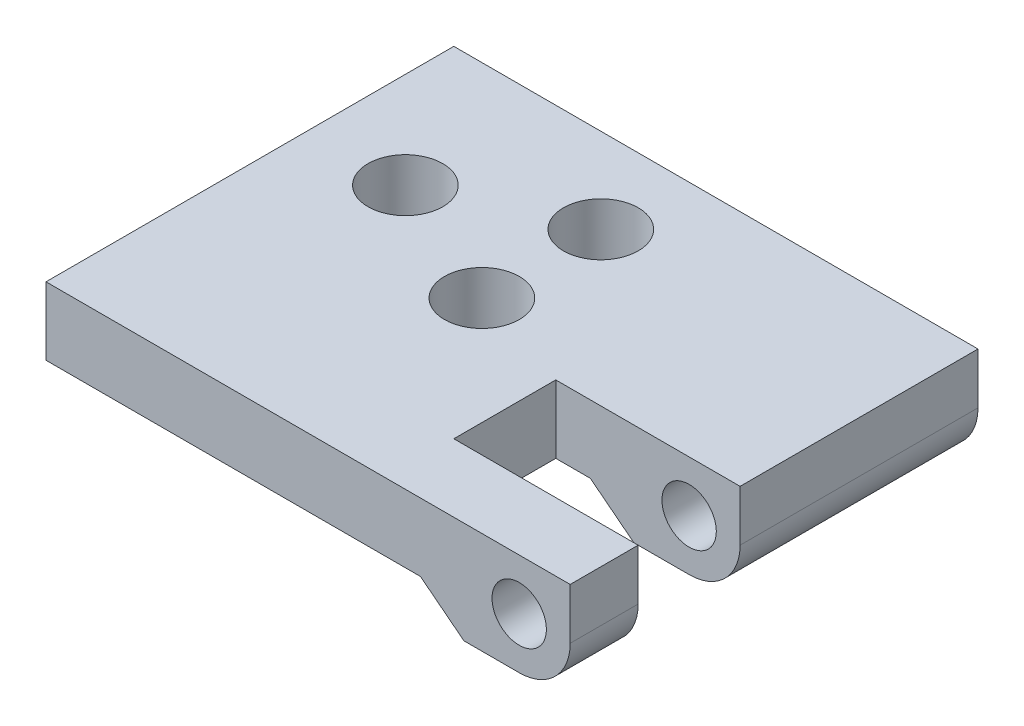
ISO-10303-21;
HEADER;
FILE_DESCRIPTION(('STEP AP214'),'2;1');
FILE_NAME('part.step','',(''),(''),'','','');
FILE_SCHEMA(('AUTOMOTIVE_DESIGN { 1 0 10303 214 1 1 1 1 }'));
ENDSEC;
DATA;
#1=APPLICATION_CONTEXT('core data for automotive mechanical design processes');
#2=APPLICATION_PROTOCOL_DEFINITION('international standard','automotive_design',2000,#1);
#3=PRODUCT_CONTEXT('',#1,'mechanical');
#4=PRODUCT('Part','Part','',(#3));
#5=PRODUCT_RELATED_PRODUCT_CATEGORY('part','',(#4));
#6=PRODUCT_DEFINITION_FORMATION('','',#4);
#7=PRODUCT_DEFINITION_CONTEXT('part definition',#1,'design');
#8=PRODUCT_DEFINITION('design','',#6,#7);
#9=PRODUCT_DEFINITION_SHAPE('','',#8);
#10=(LENGTH_UNIT() NAMED_UNIT(*) SI_UNIT(.MILLI.,.METRE.));
#11=(NAMED_UNIT(*) PLANE_ANGLE_UNIT() SI_UNIT($,.RADIAN.));
#12=(NAMED_UNIT(*) SI_UNIT($,.STERADIAN.) SOLID_ANGLE_UNIT());
#13=UNCERTAINTY_MEASURE_WITH_UNIT(LENGTH_MEASURE(1.E-05),#10,'distance_accuracy_value','');
#14=(GEOMETRIC_REPRESENTATION_CONTEXT(3) GLOBAL_UNCERTAINTY_ASSIGNED_CONTEXT((#13)) GLOBAL_UNIT_ASSIGNED_CONTEXT((#10,
#11,#12)) REPRESENTATION_CONTEXT('',''));
#15=CARTESIAN_POINT('',(0.,0.,0.));
#16=DIRECTION('',(0.,0.,1.));
#17=DIRECTION('',(1.,0.,0.));
#18=AXIS2_PLACEMENT_3D('',#15,#16,#17);
#19=CARTESIAN_POINT('',(2.15277777777778,3.,14.2992424242425));
#20=DIRECTION('',(0.,0.,-1.));
#21=DIRECTION('',(-1.,0.,0.));
#22=AXIS2_PLACEMENT_3D('',#19,#20,#21);
#23=CYLINDRICAL_SURFACE('',#22,3.);
#24=CARTESIAN_POINT('',(2.15277777777778,3.,10.2992424242425));
#25=DIRECTION('',(0.,0.,1.));
#26=DIRECTION('',(1.,0.,0.));
#27=AXIS2_PLACEMENT_3D('',#24,#25,#26);
#28=CIRCLE('',#27,3.);
#29=CARTESIAN_POINT('',(5.15277777777778,3.,10.2992424242425));
#30=VERTEX_POINT('',#29);
#31=CARTESIAN_POINT('',(2.15277777777778,0.,10.2992424242425));
#32=VERTEX_POINT('',#31);
#33=EDGE_CURVE('E194',#30,#32,#28,.F.);
#34=ORIENTED_EDGE('',*,*,#33,.F.);
#35=DIRECTION('',(0.,0.,-1.));
#36=VECTOR('',#35,1.);
#37=CARTESIAN_POINT('',(5.15277777777778,3.,14.2992424242425));
#38=LINE('',#37,#36);
#39=CARTESIAN_POINT('',(5.15277777777778,3.,14.2992424242425));
#40=VERTEX_POINT('',#39);
#41=EDGE_CURVE('E179',#40,#30,#38,.T.);
#42=ORIENTED_EDGE('',*,*,#41,.F.);
#43=CARTESIAN_POINT('',(2.15277777777778,3.,14.2992424242425));
#44=DIRECTION('',(0.,0.,1.));
#45=DIRECTION('',(1.,0.,0.));
#46=AXIS2_PLACEMENT_3D('',#43,#44,#45);
#47=CIRCLE('',#46,3.);
#48=CARTESIAN_POINT('',(2.15277777777778,0.,14.2992424242425));
#49=VERTEX_POINT('',#48);
#50=EDGE_CURVE('E181',#49,#40,#47,.T.);
#51=ORIENTED_EDGE('',*,*,#50,.F.);
#52=DIRECTION('',(0.,0.,-1.));
#53=VECTOR('',#52,1.);
#54=CARTESIAN_POINT('',(2.15277777777778,0.,14.2992424242425));
#55=LINE('',#54,#53);
#56=EDGE_CURVE('E189',#49,#32,#55,.T.);
#57=ORIENTED_EDGE('',*,*,#56,.T.);
#58=EDGE_LOOP('',(#34,#42,#51,#57));
#59=FACE_BOUND('',#58,.T.);
#60=ADVANCED_FACE('F41',(#59),#23,.T.);
#61=CARTESIAN_POINT('',(5.15277777777778,0.,14.2992424242425));
#62=DIRECTION('',(1.,0.,0.));
#63=DIRECTION('',(0.,1.,0.));
#64=AXIS2_PLACEMENT_3D('',#61,#62,#63);
#65=PLANE('',#64);
#66=DIRECTION('',(0.,-1.,0.));
#67=VECTOR('',#66,1.);
#68=CARTESIAN_POINT('',(5.15277777777778,0.,10.2992424242425));
#69=LINE('',#68,#67);
#70=CARTESIAN_POINT('',(5.15277777777778,6.,10.2992424242425));
#71=VERTEX_POINT('',#70);
#72=EDGE_CURVE('E11',#71,#30,#69,.T.);
#73=ORIENTED_EDGE('',*,*,#72,.F.);
#74=DIRECTION('',(0.,0.,-1.));
#75=VECTOR('',#74,1.);
#76=CARTESIAN_POINT('',(5.15277777777778,6.,14.2992424242425));
#77=LINE('',#76,#75);
#78=CARTESIAN_POINT('',(5.15277777777778,6.,14.2992424242425));
#79=VERTEX_POINT('',#78);
#80=EDGE_CURVE('E169',#79,#71,#77,.T.);
#81=ORIENTED_EDGE('',*,*,#80,.F.);
#82=DIRECTION('',(0.,-1.,0.));
#83=VECTOR('',#82,1.);
#84=CARTESIAN_POINT('',(5.15277777777778,0.,14.2992424242425));
#85=LINE('',#84,#83);
#86=EDGE_CURVE('E170',#79,#40,#85,.T.);
#87=ORIENTED_EDGE('',*,*,#86,.T.);
#88=ORIENTED_EDGE('',*,*,#41,.T.);
#89=EDGE_LOOP('',(#73,#81,#87,#88));
#90=FACE_BOUND('',#89,.T.);
#91=ADVANCED_FACE('F348',(#90),#65,.T.);
#92=CARTESIAN_POINT('',(0.,0.,0.));
#93=DIRECTION('',(0.,1.,0.));
#94=DIRECTION('',(0.,0.,1.));
#95=AXIS2_PLACEMENT_3D('',#92,#93,#94);
#96=PLANE('',#95);
#97=DIRECTION('',(-1.,0.,0.));
#98=VECTOR('',#97,1.);
#99=CARTESIAN_POINT('',(0.,0.,10.2992424242425));
#100=LINE('',#99,#98);
#101=CARTESIAN_POINT('',(-1.10011235807583,0.,10.2992424242425));
#102=VERTEX_POINT('',#101);
#103=EDGE_CURVE('E269',#32,#102,#100,.T.);
#104=ORIENTED_EDGE('',*,*,#103,.F.);
#105=ORIENTED_EDGE('',*,*,#56,.F.);
#106=DIRECTION('',(1.,0.,0.));
#107=VECTOR('',#106,1.);
#108=CARTESIAN_POINT('',(0.,0.,14.2992424242425));
#109=LINE('',#108,#107);
#110=CARTESIAN_POINT('',(-1.10011235807583,0.,14.2992424242425));
#111=VERTEX_POINT('',#110);
#112=EDGE_CURVE('E275',#111,#49,#109,.T.);
#113=ORIENTED_EDGE('',*,*,#112,.F.);
#114=DIRECTION('',(0.,0.,1.));
#115=VECTOR('',#114,1.);
#116=CARTESIAN_POINT('',(-1.10011235807583,0.,-12.7007575757576));
#117=LINE('',#116,#115);
#118=EDGE_CURVE('E202',#102,#111,#117,.T.);
#119=ORIENTED_EDGE('',*,*,#118,.F.);
#120=EDGE_LOOP('',(#104,#105,#113,#119));
#121=FACE_BOUND('',#120,.T.);
#122=ADVANCED_FACE('F383',(#121),#96,.F.);
#123=CARTESIAN_POINT('',(0.,6.,10.2992424242425));
#124=DIRECTION('',(0.,0.,1.));
#125=DIRECTION('',(1.,0.,0.));
#126=AXIS2_PLACEMENT_3D('',#123,#124,#125);
#127=PLANE('',#126);
#128=CARTESIAN_POINT('',(2.15277777777778,3.,10.2992424242425));
#129=DIRECTION('',(0.,0.,1.));
#130=DIRECTION('',(1.,0.,0.));
#131=AXIS2_PLACEMENT_3D('',#128,#129,#130);
#132=CIRCLE('',#131,1.6);
#133=CARTESIAN_POINT('',(3.75277777777778,3.,10.2992424242425));
#134=VERTEX_POINT('',#133);
#135=EDGE_CURVE('E265',#134,#134,#132,.T.);
#136=ORIENTED_EDGE('',*,*,#135,.T.);
#137=EDGE_LOOP('',(#136));
#138=FACE_BOUND('',#137,.T.);
#139=DIRECTION('',(-1.,0.,0.));
#140=VECTOR('',#139,1.);
#141=CARTESIAN_POINT('',(0.,6.,10.2992424242425));
#142=LINE('',#141,#140);
#143=CARTESIAN_POINT('',(-5.69444444444444,6.,10.2992424242425));
#144=VERTEX_POINT('',#143);
#145=EDGE_CURVE('E64',#71,#144,#142,.T.);
#146=ORIENTED_EDGE('',*,*,#145,.F.);
#147=ORIENTED_EDGE('',*,*,#72,.T.);
#148=ORIENTED_EDGE('',*,*,#33,.T.);
#149=ORIENTED_EDGE('',*,*,#103,.T.);
#150=DIRECTION('',(0.787792651553475,-0.615940531348884,0.));
#151=VECTOR('',#150,1.);
#152=CARTESIAN_POINT('',(-3.3287641850322,1.74248514222652,10.2992424242425));
#153=LINE('',#152,#151);
#154=CARTESIAN_POINT('',(-3.65812765811865,2.,10.2992424242425));
#155=VERTEX_POINT('',#154);
#156=EDGE_CURVE('E214',#155,#102,#153,.T.);
#157=ORIENTED_EDGE('',*,*,#156,.F.);
#158=DIRECTION('',(1.,0.,0.));
#159=VECTOR('',#158,1.);
#160=CARTESIAN_POINT('',(0.,2.,10.2992424242425));
#161=LINE('',#160,#159);
#162=CARTESIAN_POINT('',(-5.69444444444444,2.,10.2992424242425));
#163=VERTEX_POINT('',#162);
#164=EDGE_CURVE('E249',#163,#155,#161,.T.);
#165=ORIENTED_EDGE('',*,*,#164,.F.);
#166=DIRECTION('',(0.,-1.,0.));
#167=VECTOR('',#166,1.);
#168=CARTESIAN_POINT('',(-5.69444444444444,6.,10.2992424242425));
#169=LINE('',#168,#167);
#170=EDGE_CURVE('E163',#144,#163,#169,.T.);
#171=ORIENTED_EDGE('',*,*,#170,.F.);
#172=EDGE_LOOP('',(#146,#147,#148,#149,#157,#165,#171));
#173=FACE_BOUND('',#172,.T.);
#174=ADVANCED_FACE('F341',(#138,#173),#127,.F.);
#175=CARTESIAN_POINT('',(0.,6.,4.29924242424245));
#176=DIRECTION('',(0.,0.,1.));
#177=DIRECTION('',(1.,0.,0.));
#178=AXIS2_PLACEMENT_3D('',#175,#176,#177);
#179=PLANE('',#178);
#180=CARTESIAN_POINT('',(2.15277777777778,3.,4.29924242424245));
#181=DIRECTION('',(0.,0.,1.));
#182=DIRECTION('',(1.,0.,0.));
#183=AXIS2_PLACEMENT_3D('',#180,#181,#182);
#184=CIRCLE('',#183,3.);
#185=CARTESIAN_POINT('',(5.15277777777778,3.,4.29924242424245));
#186=VERTEX_POINT('',#185);
#187=CARTESIAN_POINT('',(2.15277777777778,0.,4.29924242424245));
#188=VERTEX_POINT('',#187);
#189=EDGE_CURVE('E57',#186,#188,#184,.F.);
#190=ORIENTED_EDGE('',*,*,#189,.F.);
#191=DIRECTION('',(0.,1.,0.));
#192=VECTOR('',#191,1.);
#193=CARTESIAN_POINT('',(5.15277777777778,0.,4.29924242424245));
#194=LINE('',#193,#192);
#195=CARTESIAN_POINT('',(5.15277777777779,6.,4.29924242424245));
#196=VERTEX_POINT('',#195);
#197=EDGE_CURVE('E50',#186,#196,#194,.T.);
#198=ORIENTED_EDGE('',*,*,#197,.T.);
#199=DIRECTION('',(-1.,0.,0.));
#200=VECTOR('',#199,1.);
#201=CARTESIAN_POINT('',(0.,6.,4.29924242424245));
#202=LINE('',#201,#200);
#203=CARTESIAN_POINT('',(-5.69444444444444,6.,4.29924242424245));
#204=VERTEX_POINT('',#203);
#205=EDGE_CURVE('E144',#196,#204,#202,.T.);
#206=ORIENTED_EDGE('',*,*,#205,.T.);
#207=DIRECTION('',(0.,-1.,0.));
#208=VECTOR('',#207,1.);
#209=CARTESIAN_POINT('',(-5.69444444444444,6.,4.29924242424245));
#210=LINE('',#209,#208);
#211=CARTESIAN_POINT('',(-5.69444444444444,2.,4.29924242424245));
#212=VERTEX_POINT('',#211);
#213=EDGE_CURVE('E315',#204,#212,#210,.T.);
#214=ORIENTED_EDGE('',*,*,#213,.T.);
#215=DIRECTION('',(1.,0.,0.));
#216=VECTOR('',#215,1.);
#217=CARTESIAN_POINT('',(0.,2.,4.29924242424245));
#218=LINE('',#217,#216);
#219=CARTESIAN_POINT('',(-3.65812765811865,2.,4.29924242424245));
#220=VERTEX_POINT('',#219);
#221=EDGE_CURVE('E242',#212,#220,#218,.T.);
#222=ORIENTED_EDGE('',*,*,#221,.T.);
#223=DIRECTION('',(0.787792651553475,-0.615940531348884,0.));
#224=VECTOR('',#223,1.);
#225=CARTESIAN_POINT('',(-3.3287641850322,1.74248514222653,4.29924242424245));
#226=LINE('',#225,#224);
#227=CARTESIAN_POINT('',(-1.10011235807583,0.,4.29924242424245));
#228=VERTEX_POINT('',#227);
#229=EDGE_CURVE('E210',#220,#228,#226,.T.);
#230=ORIENTED_EDGE('',*,*,#229,.T.);
#231=DIRECTION('',(-1.,0.,0.));
#232=VECTOR('',#231,1.);
#233=CARTESIAN_POINT('',(0.,0.,4.29924242424245));
#234=LINE('',#233,#232);
#235=EDGE_CURVE('E298',#188,#228,#234,.T.);
#236=ORIENTED_EDGE('',*,*,#235,.F.);
#237=EDGE_LOOP('',(#190,#198,#206,#214,#222,#230,#236));
#238=FACE_BOUND('',#237,.T.);
#239=CARTESIAN_POINT('',(2.15277777777778,3.,4.29924242424245));
#240=DIRECTION('',(0.,0.,1.));
#241=DIRECTION('',(1.,0.,0.));
#242=AXIS2_PLACEMENT_3D('',#239,#240,#241);
#243=CIRCLE('',#242,1.6);
#244=CARTESIAN_POINT('',(3.75277777777778,3.,4.29924242424245));
#245=VERTEX_POINT('',#244);
#246=EDGE_CURVE('E261',#245,#245,#243,.T.);
#247=ORIENTED_EDGE('',*,*,#246,.F.);
#248=EDGE_LOOP('',(#247));
#249=FACE_BOUND('',#248,.T.);
#250=ADVANCED_FACE('F158',(#238,#249),#179,.T.);
#251=CARTESIAN_POINT('',(0.,6.,-9.70075757575754));
#252=DIRECTION('',(0.,0.,-1.));
#253=DIRECTION('',(-1.,0.,0.));
#254=AXIS2_PLACEMENT_3D('',#251,#252,#253);
#255=PLANE('',#254);
#256=CARTESIAN_POINT('',(2.15277777777778,3.,-9.70075757575754));
#257=DIRECTION('',(0.,0.,1.));
#258=DIRECTION('',(1.,0.,0.));
#259=AXIS2_PLACEMENT_3D('',#256,#257,#258);
#260=CIRCLE('',#259,3.);
#261=CARTESIAN_POINT('',(2.15277777777778,0.,-9.70075757575754));
#262=VERTEX_POINT('',#261);
#263=CARTESIAN_POINT('',(5.15277777777778,3.,-9.70075757575754));
#264=VERTEX_POINT('',#263);
#265=EDGE_CURVE('E185',#262,#264,#260,.T.);
#266=ORIENTED_EDGE('',*,*,#265,.F.);
#267=DIRECTION('',(1.,0.,0.));
#268=VECTOR('',#267,1.);
#269=CARTESIAN_POINT('',(0.,0.,-9.70075757575754));
#270=LINE('',#269,#268);
#271=CARTESIAN_POINT('',(-1.10011235807583,0.,-9.70075757575754));
#272=VERTEX_POINT('',#271);
#273=EDGE_CURVE('E301',#272,#262,#270,.T.);
#274=ORIENTED_EDGE('',*,*,#273,.F.);
#275=DIRECTION('',(-0.787792651553475,0.615940531348884,0.));
#276=VECTOR('',#275,1.);
#277=CARTESIAN_POINT('',(-3.32876418503221,1.74248514222653,-9.70075757575754));
#278=LINE('',#277,#276);
#279=CARTESIAN_POINT('',(-3.65812765811865,2.,-9.70075757575754));
#280=VERTEX_POINT('',#279);
#281=EDGE_CURVE('E206',#272,#280,#278,.T.);
#282=ORIENTED_EDGE('',*,*,#281,.T.);
#283=DIRECTION('',(1.,0.,0.));
#284=VECTOR('',#283,1.);
#285=CARTESIAN_POINT('',(-25.6944444444444,2.,-9.70075757575754));
#286=LINE('',#285,#284);
#287=CARTESIAN_POINT('',(-25.6944444444444,2.,-9.70075757575754));
#288=VERTEX_POINT('',#287);
#289=EDGE_CURVE('E221',#288,#280,#286,.T.);
#290=ORIENTED_EDGE('',*,*,#289,.F.);
#291=DIRECTION('',(0.,-1.,0.));
#292=VECTOR('',#291,1.);
#293=CARTESIAN_POINT('',(-25.6944444444444,6.,-9.70075757575754));
#294=LINE('',#293,#292);
#295=CARTESIAN_POINT('',(-25.6944444444444,6.,-9.70075757575754));
#296=VERTEX_POINT('',#295);
#297=EDGE_CURVE('E311',#296,#288,#294,.T.);
#298=ORIENTED_EDGE('',*,*,#297,.F.);
#299=DIRECTION('',(1.,0.,0.));
#300=VECTOR('',#299,1.);
#301=CARTESIAN_POINT('',(0.,6.,-9.70075757575754));
#302=LINE('',#301,#300);
#303=CARTESIAN_POINT('',(5.15277777777778,6.,-9.70075757575754));
#304=VERTEX_POINT('',#303);
#305=EDGE_CURVE('E156',#296,#304,#302,.T.);
#306=ORIENTED_EDGE('',*,*,#305,.T.);
#307=DIRECTION('',(0.,-1.,0.));
#308=VECTOR('',#307,1.);
#309=CARTESIAN_POINT('',(5.15277777777778,0.,-9.70075757575754));
#310=LINE('',#309,#308);
#311=EDGE_CURVE('E167',#304,#264,#310,.T.);
#312=ORIENTED_EDGE('',*,*,#311,.T.);
#313=EDGE_LOOP('',(#266,#274,#282,#290,#298,#306,#312));
#314=FACE_BOUND('',#313,.T.);
#315=CARTESIAN_POINT('',(2.15277777777778,3.,-9.70075757575754));
#316=DIRECTION('',(0.,0.,-1.));
#317=DIRECTION('',(-1.,0.,0.));
#318=AXIS2_PLACEMENT_3D('',#315,#316,#317);
#319=CIRCLE('',#318,1.6);
#320=CARTESIAN_POINT('',(0.552777777777779,3.,-9.70075757575754));
#321=VERTEX_POINT('',#320);
#322=EDGE_CURVE('E257',#321,#321,#319,.T.);
#323=ORIENTED_EDGE('',*,*,#322,.F.);
#324=EDGE_LOOP('',(#323));
#325=FACE_BOUND('',#324,.T.);
#326=ADVANCED_FACE('F364',(#314,#325),#255,.T.);
#327=CARTESIAN_POINT('',(0.,6.,14.2992424242425));
#328=DIRECTION('',(0.,0.,-1.));
#329=DIRECTION('',(-1.,0.,0.));
#330=AXIS2_PLACEMENT_3D('',#327,#328,#329);
#331=PLANE('',#330);
#332=CARTESIAN_POINT('',(2.15277777777778,3.,14.2992424242425));
#333=DIRECTION('',(0.,0.,1.));
#334=DIRECTION('',(1.,0.,0.));
#335=AXIS2_PLACEMENT_3D('',#332,#333,#334);
#336=CIRCLE('',#335,1.6);
#337=CARTESIAN_POINT('',(3.75277777777778,3.,14.2992424242425));
#338=VERTEX_POINT('',#337);
#339=EDGE_CURVE('E253',#338,#338,#336,.T.);
#340=ORIENTED_EDGE('',*,*,#339,.F.);
#341=EDGE_LOOP('',(#340));
#342=FACE_BOUND('',#341,.T.);
#343=ORIENTED_EDGE('',*,*,#112,.T.);
#344=ORIENTED_EDGE('',*,*,#50,.T.);
#345=ORIENTED_EDGE('',*,*,#86,.F.);
#346=DIRECTION('',(1.,0.,0.));
#347=VECTOR('',#346,1.);
#348=CARTESIAN_POINT('',(0.,6.,14.2992424242425));
#349=LINE('',#348,#347);
#350=CARTESIAN_POINT('',(-25.6944444444444,6.,14.2992424242425));
#351=VERTEX_POINT('',#350);
#352=EDGE_CURVE('E292',#351,#79,#349,.T.);
#353=ORIENTED_EDGE('',*,*,#352,.F.);
#354=DIRECTION('',(0.,-1.,0.));
#355=VECTOR('',#354,1.);
#356=CARTESIAN_POINT('',(-25.6944444444444,6.,14.2992424242425));
#357=LINE('',#356,#355);
#358=CARTESIAN_POINT('',(-25.6944444444444,2.,14.2992424242425));
#359=VERTEX_POINT('',#358);
#360=EDGE_CURVE('E295',#351,#359,#357,.T.);
#361=ORIENTED_EDGE('',*,*,#360,.T.);
#362=DIRECTION('',(-1.,0.,0.));
#363=VECTOR('',#362,1.);
#364=CARTESIAN_POINT('',(-25.6944444444444,2.,14.2992424242425));
#365=LINE('',#364,#363);
#366=CARTESIAN_POINT('',(-3.65812765811865,2.,14.2992424242425));
#367=VERTEX_POINT('',#366);
#368=EDGE_CURVE('E230',#367,#359,#365,.T.);
#369=ORIENTED_EDGE('',*,*,#368,.F.);
#370=DIRECTION('',(0.787792651553475,-0.615940531348884,0.));
#371=VECTOR('',#370,1.);
#372=CARTESIAN_POINT('',(-0.417363638688644,-0.533811286723548,14.2992424242425));
#373=LINE('',#372,#371);
#374=EDGE_CURVE('E198',#367,#111,#373,.T.);
#375=ORIENTED_EDGE('',*,*,#374,.T.);
#376=EDGE_LOOP('',(#343,#344,#345,#353,#361,#369,#375));
#377=FACE_BOUND('',#376,.T.);
#378=ADVANCED_FACE('F351',(#342,#377),#331,.F.);
#379=ORIENTED_EDGE('',*,*,#273,.T.);
#380=EDGE_CURVE('E184',#188,#262,#55,.T.);
#381=ORIENTED_EDGE('',*,*,#380,.F.);
#382=ORIENTED_EDGE('',*,*,#235,.T.);
#383=EDGE_CURVE('E205',#272,#228,#117,.T.);
#384=ORIENTED_EDGE('',*,*,#383,.F.);
#385=EDGE_LOOP('',(#379,#381,#382,#384));
#386=FACE_BOUND('',#385,.T.);
#387=ADVANCED_FACE('F377',(#386),#96,.F.);
#388=CARTESIAN_POINT('',(-5.69444444444444,6.,0.));
#389=DIRECTION('',(-1.,0.,0.));
#390=DIRECTION('',(0.,0.,1.));
#391=AXIS2_PLACEMENT_3D('',#388,#389,#390);
#392=PLANE('',#391);
#393=DIRECTION('',(0.,0.,1.));
#394=VECTOR('',#393,1.);
#395=CARTESIAN_POINT('',(-5.69444444444444,2.,0.));
#396=LINE('',#395,#394);
#397=EDGE_CURVE('E246',#212,#163,#396,.T.);
#398=ORIENTED_EDGE('',*,*,#397,.F.);
#399=ORIENTED_EDGE('',*,*,#213,.F.);
#400=DIRECTION('',(0.,0.,-1.));
#401=VECTOR('',#400,1.);
#402=CARTESIAN_POINT('',(-5.69444444444444,6.,0.));
#403=LINE('',#402,#401);
#404=EDGE_CURVE('E152',#144,#204,#403,.T.);
#405=ORIENTED_EDGE('',*,*,#404,.F.);
#406=ORIENTED_EDGE('',*,*,#170,.T.);
#407=EDGE_LOOP('',(#398,#399,#405,#406));
#408=FACE_BOUND('',#407,.T.);
#409=ADVANCED_FACE('F343',(#408),#392,.F.);
#410=CARTESIAN_POINT('',(-25.6944444444444,6.,0.));
#411=DIRECTION('',(1.,0.,0.));
#412=DIRECTION('',(0.,0.,-1.));
#413=AXIS2_PLACEMENT_3D('',#410,#411,#412);
#414=PLANE('',#413);
#415=DIRECTION('',(0.,0.,-1.));
#416=VECTOR('',#415,1.);
#417=CARTESIAN_POINT('',(-25.6944444444444,2.,14.2992424242425));
#418=LINE('',#417,#416);
#419=EDGE_CURVE('E218',#359,#288,#418,.T.);
#420=ORIENTED_EDGE('',*,*,#419,.F.);
#421=ORIENTED_EDGE('',*,*,#360,.F.);
#422=DIRECTION('',(0.,0.,1.));
#423=VECTOR('',#422,1.);
#424=CARTESIAN_POINT('',(-25.6944444444444,6.,0.));
#425=LINE('',#424,#423);
#426=EDGE_CURVE('E289',#296,#351,#425,.T.);
#427=ORIENTED_EDGE('',*,*,#426,.F.);
#428=ORIENTED_EDGE('',*,*,#297,.T.);
#429=EDGE_LOOP('',(#420,#421,#427,#428));
#430=FACE_BOUND('',#429,.T.);
#431=ADVANCED_FACE('F372',(#430),#414,.F.);
#432=CARTESIAN_POINT('',(-20.0432574610932,6.,-1.20075757575754));
#433=DIRECTION('',(0.,-1.,0.));
#434=DIRECTION('',(0.,0.,-1.));
#435=AXIS2_PLACEMENT_3D('',#432,#433,#434);
#436=CYLINDRICAL_SURFACE('',#435,2.2);
#437=CARTESIAN_POINT('',(-20.0432574610932,6.,-1.20075757575754));
#438=DIRECTION('',(0.,1.,0.));
#439=DIRECTION('',(0.,0.,1.));
#440=AXIS2_PLACEMENT_3D('',#437,#438,#439);
#441=CIRCLE('',#440,2.2);
#442=CARTESIAN_POINT('',(-20.0432574610932,6.,0.999242424242458));
#443=VERTEX_POINT('',#442);
#444=EDGE_CURVE('E279',#443,#443,#441,.T.);
#445=ORIENTED_EDGE('',*,*,#444,.T.);
#446=EDGE_LOOP('',(#445));
#447=FACE_BOUND('',#446,.T.);
#448=CARTESIAN_POINT('',(-20.0432574610932,2.,-1.20075757575754));
#449=DIRECTION('',(0.,-1.,0.));
#450=DIRECTION('',(0.,0.,-1.));
#451=AXIS2_PLACEMENT_3D('',#448,#449,#450);
#452=CIRCLE('',#451,2.2);
#453=CARTESIAN_POINT('',(-20.0432574610932,2.,-3.40075757575755));
#454=VERTEX_POINT('',#453);
#455=EDGE_CURVE('E238',#454,#454,#452,.T.);
#456=ORIENTED_EDGE('',*,*,#455,.T.);
#457=EDGE_LOOP('',(#456));
#458=FACE_BOUND('',#457,.T.);
#459=ADVANCED_FACE('F426',(#447,#458),#436,.F.);
#460=CARTESIAN_POINT('',(-12.0432574610932,6.,-4.70075757575754));
#461=DIRECTION('',(0.,-1.,0.));
#462=DIRECTION('',(0.,0.,-1.));
#463=AXIS2_PLACEMENT_3D('',#460,#461,#462);
#464=CYLINDRICAL_SURFACE('',#463,2.2);
#465=CARTESIAN_POINT('',(-12.0432574610932,6.,-4.70075757575754));
#466=DIRECTION('',(0.,1.,0.));
#467=DIRECTION('',(0.,0.,1.));
#468=AXIS2_PLACEMENT_3D('',#465,#466,#467);
#469=CIRCLE('',#468,2.2);
#470=CARTESIAN_POINT('',(-12.0432574610932,6.,-2.50075757575754));
#471=VERTEX_POINT('',#470);
#472=EDGE_CURVE('E274',#471,#471,#469,.T.);
#473=ORIENTED_EDGE('',*,*,#472,.T.);
#474=EDGE_LOOP('',(#473));
#475=FACE_BOUND('',#474,.T.);
#476=CARTESIAN_POINT('',(-12.0432574610932,2.,-4.70075757575754));
#477=DIRECTION('',(0.,-1.,0.));
#478=DIRECTION('',(0.,0.,-1.));
#479=AXIS2_PLACEMENT_3D('',#476,#477,#478);
#480=CIRCLE('',#479,2.2);
#481=CARTESIAN_POINT('',(-12.0432574610932,2.,-6.90075757575754));
#482=VERTEX_POINT('',#481);
#483=EDGE_CURVE('E234',#482,#482,#480,.T.);
#484=ORIENTED_EDGE('',*,*,#483,.T.);
#485=EDGE_LOOP('',(#484));
#486=FACE_BOUND('',#485,.T.);
#487=ADVANCED_FACE('F421',(#475,#486),#464,.F.);
#488=CARTESIAN_POINT('',(-12.0432574610932,6.,2.29924242424246));
#489=DIRECTION('',(0.,-1.,0.));
#490=DIRECTION('',(0.,0.,-1.));
#491=AXIS2_PLACEMENT_3D('',#488,#489,#490);
#492=CYLINDRICAL_SURFACE('',#491,2.2);
#493=CARTESIAN_POINT('',(-12.0432574610932,6.,2.29924242424246));
#494=DIRECTION('',(0.,1.,0.));
#495=DIRECTION('',(0.,0.,1.));
#496=AXIS2_PLACEMENT_3D('',#493,#494,#495);
#497=CIRCLE('',#496,2.2);
#498=CARTESIAN_POINT('',(-12.0432574610932,6.,4.49924242424246));
#499=VERTEX_POINT('',#498);
#500=EDGE_CURVE('E270',#499,#499,#497,.T.);
#501=ORIENTED_EDGE('',*,*,#500,.T.);
#502=EDGE_LOOP('',(#501));
#503=FACE_BOUND('',#502,.T.);
#504=CARTESIAN_POINT('',(-12.0432574610932,2.,2.29924242424246));
#505=DIRECTION('',(0.,-1.,0.));
#506=DIRECTION('',(0.,0.,-1.));
#507=AXIS2_PLACEMENT_3D('',#504,#505,#506);
#508=CIRCLE('',#507,2.2);
#509=CARTESIAN_POINT('',(-12.0432574610932,2.,0.0992424242424552));
#510=VERTEX_POINT('',#509);
#511=EDGE_CURVE('E233',#510,#510,#508,.T.);
#512=ORIENTED_EDGE('',*,*,#511,.T.);
#513=EDGE_LOOP('',(#512));
#514=FACE_BOUND('',#513,.T.);
#515=ADVANCED_FACE('F43',(#503,#514),#492,.F.);
#516=CARTESIAN_POINT('',(0.,6.,0.));
#517=DIRECTION('',(0.,1.,0.));
#518=DIRECTION('',(0.,0.,1.));
#519=AXIS2_PLACEMENT_3D('',#516,#517,#518);
#520=PLANE('',#519);
#521=ORIENTED_EDGE('',*,*,#80,.T.);
#522=ORIENTED_EDGE('',*,*,#145,.T.);
#523=ORIENTED_EDGE('',*,*,#404,.T.);
#524=ORIENTED_EDGE('',*,*,#205,.F.);
#525=EDGE_CURVE('E150',#196,#304,#77,.T.);
#526=ORIENTED_EDGE('',*,*,#525,.T.);
#527=ORIENTED_EDGE('',*,*,#305,.F.);
#528=ORIENTED_EDGE('',*,*,#426,.T.);
#529=ORIENTED_EDGE('',*,*,#352,.T.);
#530=EDGE_LOOP('',(#521,#522,#523,#524,#526,#527,#528,#529));
#531=FACE_BOUND('',#530,.T.);
#532=ORIENTED_EDGE('',*,*,#500,.F.);
#533=EDGE_LOOP('',(#532));
#534=FACE_BOUND('',#533,.T.);
#535=ORIENTED_EDGE('',*,*,#472,.F.);
#536=EDGE_LOOP('',(#535));
#537=FACE_BOUND('',#536,.T.);
#538=ORIENTED_EDGE('',*,*,#444,.F.);
#539=EDGE_LOOP('',(#538));
#540=FACE_BOUND('',#539,.T.);
#541=ADVANCED_FACE('F146',(#531,#534,#537,#540),#520,.T.);
#542=CARTESIAN_POINT('',(2.15277777777778,3.,-11.7007575757576));
#543=DIRECTION('',(0.,0.,1.));
#544=DIRECTION('',(1.,0.,0.));
#545=AXIS2_PLACEMENT_3D('',#542,#543,#544);
#546=CYLINDRICAL_SURFACE('',#545,1.6);
#547=ORIENTED_EDGE('',*,*,#339,.T.);
#548=EDGE_LOOP('',(#547));
#549=FACE_BOUND('',#548,.T.);
#550=ORIENTED_EDGE('',*,*,#135,.F.);
#551=EDGE_LOOP('',(#550));
#552=FACE_BOUND('',#551,.T.);
#553=ADVANCED_FACE('F413',(#549,#552),#546,.F.);
#554=ORIENTED_EDGE('',*,*,#246,.T.);
#555=EDGE_LOOP('',(#554));
#556=FACE_BOUND('',#555,.T.);
#557=ORIENTED_EDGE('',*,*,#322,.T.);
#558=EDGE_LOOP('',(#557));
#559=FACE_BOUND('',#558,.T.);
#560=ADVANCED_FACE('F330',(#556,#559),#546,.F.);
#561=CARTESIAN_POINT('',(0.,2.,0.));
#562=DIRECTION('',(0.,-1.,0.));
#563=DIRECTION('',(0.,0.,-1.));
#564=AXIS2_PLACEMENT_3D('',#561,#562,#563);
#565=PLANE('',#564);
#566=ORIENTED_EDGE('',*,*,#511,.F.);
#567=EDGE_LOOP('',(#566));
#568=FACE_BOUND('',#567,.T.);
#569=ORIENTED_EDGE('',*,*,#483,.F.);
#570=EDGE_LOOP('',(#569));
#571=FACE_BOUND('',#570,.T.);
#572=ORIENTED_EDGE('',*,*,#455,.F.);
#573=EDGE_LOOP('',(#572));
#574=FACE_BOUND('',#573,.T.);
#575=ORIENTED_EDGE('',*,*,#164,.T.);
#576=DIRECTION('',(0.,0.,1.));
#577=VECTOR('',#576,1.);
#578=CARTESIAN_POINT('',(-3.65812765811865,2.,14.2992424242425));
#579=LINE('',#578,#577);
#580=EDGE_CURVE('E225',#155,#367,#579,.T.);
#581=ORIENTED_EDGE('',*,*,#580,.T.);
#582=ORIENTED_EDGE('',*,*,#368,.T.);
#583=ORIENTED_EDGE('',*,*,#419,.T.);
#584=ORIENTED_EDGE('',*,*,#289,.T.);
#585=EDGE_CURVE('E226',#280,#220,#579,.T.);
#586=ORIENTED_EDGE('',*,*,#585,.T.);
#587=ORIENTED_EDGE('',*,*,#221,.F.);
#588=ORIENTED_EDGE('',*,*,#397,.T.);
#589=EDGE_LOOP('',(#575,#581,#582,#583,#584,#586,#587,#588));
#590=FACE_BOUND('',#589,.T.);
#591=ADVANCED_FACE('F326',(#568,#571,#574,#590),#565,.T.);
#592=CARTESIAN_POINT('',(-0.417363638688644,-0.533811286723548,-12.7007575757576));
#593=DIRECTION('',(-0.615940531348884,-0.787792651553475,0.));
#594=DIRECTION('',(0.787792651553475,-0.615940531348884,0.));
#595=AXIS2_PLACEMENT_3D('',#592,#593,#594);
#596=PLANE('',#595);
#597=ORIENTED_EDGE('',*,*,#585,.F.);
#598=ORIENTED_EDGE('',*,*,#281,.F.);
#599=ORIENTED_EDGE('',*,*,#383,.T.);
#600=ORIENTED_EDGE('',*,*,#229,.F.);
#601=EDGE_LOOP('',(#597,#598,#599,#600));
#602=FACE_BOUND('',#601,.T.);
#603=ADVANCED_FACE('F329',(#602),#596,.T.);
#604=ORIENTED_EDGE('',*,*,#156,.T.);
#605=ORIENTED_EDGE('',*,*,#118,.T.);
#606=ORIENTED_EDGE('',*,*,#374,.F.);
#607=ORIENTED_EDGE('',*,*,#580,.F.);
#608=EDGE_LOOP('',(#604,#605,#606,#607));
#609=FACE_BOUND('',#608,.T.);
#610=ADVANCED_FACE('F402',(#609),#596,.T.);
#611=EDGE_CURVE('E174',#186,#264,#38,.T.);
#612=ORIENTED_EDGE('',*,*,#611,.F.);
#613=ORIENTED_EDGE('',*,*,#189,.T.);
#614=ORIENTED_EDGE('',*,*,#380,.T.);
#615=ORIENTED_EDGE('',*,*,#265,.T.);
#616=EDGE_LOOP('',(#612,#613,#614,#615));
#617=FACE_BOUND('',#616,.T.);
#618=ADVANCED_FACE('F360',(#617),#23,.T.);
#619=ORIENTED_EDGE('',*,*,#197,.F.);
#620=ORIENTED_EDGE('',*,*,#611,.T.);
#621=ORIENTED_EDGE('',*,*,#311,.F.);
#622=ORIENTED_EDGE('',*,*,#525,.F.);
#623=EDGE_LOOP('',(#619,#620,#621,#622));
#624=FACE_BOUND('',#623,.T.);
#625=ADVANCED_FACE('F165',(#624),#65,.T.);
#626=CLOSED_SHELL('',(#60,#91,#122,#174,#250,#326,#378,#387,#409,#431,#459,#487,#515,#541,#553,
#560,#591,#603,#610,#618,#625));
#627=MANIFOLD_SOLID_BREP('B2',#626);
#628=ADVANCED_BREP_SHAPE_REPRESENTATION('',(#18,#627),#14);
#629=SHAPE_DEFINITION_REPRESENTATION(#9,#628);
ENDSEC;
END-ISO-10303-21;
